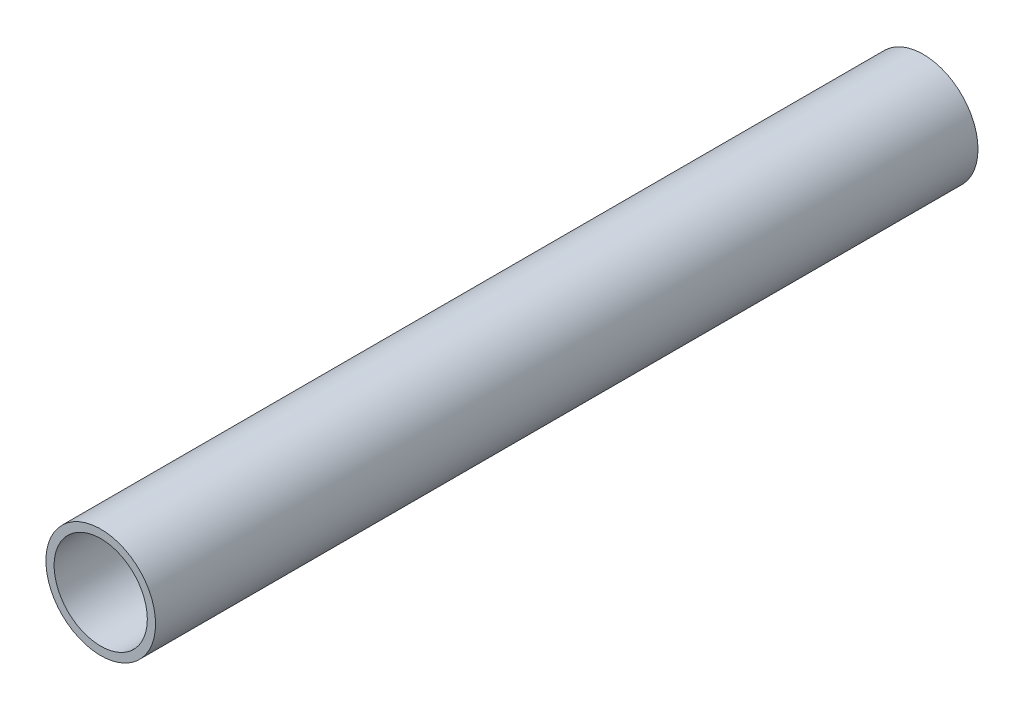
ISO-10303-21;
HEADER;
FILE_DESCRIPTION(('STEP AP214'),'2;1');
FILE_NAME('part.step','',(''),(''),'','','');
FILE_SCHEMA(('AUTOMOTIVE_DESIGN { 1 0 10303 214 1 1 1 1 }'));
ENDSEC;
DATA;
#1=APPLICATION_CONTEXT('core data for automotive mechanical design processes');
#2=APPLICATION_PROTOCOL_DEFINITION('international standard','automotive_design',2000,#1);
#3=PRODUCT_CONTEXT('',#1,'mechanical');
#4=PRODUCT('Part','Part','',(#3));
#5=PRODUCT_RELATED_PRODUCT_CATEGORY('part','',(#4));
#6=PRODUCT_DEFINITION_FORMATION('','',#4);
#7=PRODUCT_DEFINITION_CONTEXT('part definition',#1,'design');
#8=PRODUCT_DEFINITION('design','',#6,#7);
#9=PRODUCT_DEFINITION_SHAPE('','',#8);
#10=(LENGTH_UNIT() NAMED_UNIT(*) SI_UNIT(.MILLI.,.METRE.));
#11=(NAMED_UNIT(*) PLANE_ANGLE_UNIT() SI_UNIT($,.RADIAN.));
#12=(NAMED_UNIT(*) SI_UNIT($,.STERADIAN.) SOLID_ANGLE_UNIT());
#13=UNCERTAINTY_MEASURE_WITH_UNIT(LENGTH_MEASURE(1.E-05),#10,'distance_accuracy_value','');
#14=(GEOMETRIC_REPRESENTATION_CONTEXT(3) GLOBAL_UNCERTAINTY_ASSIGNED_CONTEXT((#13)) GLOBAL_UNIT_ASSIGNED_CONTEXT((#10,
#11,#12)) REPRESENTATION_CONTEXT('',''));
#15=CARTESIAN_POINT('',(0.,0.,0.));
#16=DIRECTION('',(0.,0.,1.));
#17=DIRECTION('',(1.,0.,0.));
#18=AXIS2_PLACEMENT_3D('',#15,#16,#17);
#19=CARTESIAN_POINT('',(0.,0.,300.));
#20=DIRECTION('',(0.,0.,1.));
#21=DIRECTION('',(1.,0.,0.));
#22=AXIS2_PLACEMENT_3D('',#19,#20,#21);
#23=PLANE('',#22);
#24=CARTESIAN_POINT('',(0.,0.,300.));
#25=DIRECTION('',(0.,0.,1.));
#26=DIRECTION('',(1.,0.,0.));
#27=AXIS2_PLACEMENT_3D('',#24,#25,#26);
#28=CIRCLE('',#27,20.);
#29=CARTESIAN_POINT('',(20.,0.,300.));
#30=VERTEX_POINT('',#29);
#31=EDGE_CURVE('E10',#30,#30,#28,.T.);
#32=ORIENTED_EDGE('',*,*,#31,.T.);
#33=EDGE_LOOP('',(#32));
#34=FACE_BOUND('',#33,.T.);
#35=CARTESIAN_POINT('',(0.,0.,300.));
#36=DIRECTION('',(0.,0.,1.));
#37=DIRECTION('',(1.,0.,0.));
#38=AXIS2_PLACEMENT_3D('',#35,#36,#37);
#39=CIRCLE('',#38,17.);
#40=CARTESIAN_POINT('',(17.,0.,300.));
#41=VERTEX_POINT('',#40);
#42=EDGE_CURVE('E42',#41,#41,#39,.T.);
#43=ORIENTED_EDGE('',*,*,#42,.F.);
#44=EDGE_LOOP('',(#43));
#45=FACE_BOUND('',#44,.T.);
#46=ADVANCED_FACE('F31',(#34,#45),#23,.T.);
#47=CARTESIAN_POINT('',(0.,0.,0.));
#48=DIRECTION('',(0.,0.,1.));
#49=DIRECTION('',(1.,0.,0.));
#50=AXIS2_PLACEMENT_3D('',#47,#48,#49);
#51=PLANE('',#50);
#52=CARTESIAN_POINT('',(0.,0.,0.));
#53=DIRECTION('',(0.,0.,1.));
#54=DIRECTION('',(1.,0.,0.));
#55=AXIS2_PLACEMENT_3D('',#52,#53,#54);
#56=CIRCLE('',#55,20.);
#57=CARTESIAN_POINT('',(20.,0.,0.));
#58=VERTEX_POINT('',#57);
#59=EDGE_CURVE('E35',#58,#58,#56,.T.);
#60=ORIENTED_EDGE('',*,*,#59,.F.);
#61=EDGE_LOOP('',(#60));
#62=FACE_BOUND('',#61,.T.);
#63=CARTESIAN_POINT('',(0.,0.,0.));
#64=DIRECTION('',(0.,0.,1.));
#65=DIRECTION('',(1.,0.,0.));
#66=AXIS2_PLACEMENT_3D('',#63,#64,#65);
#67=CIRCLE('',#66,17.);
#68=CARTESIAN_POINT('',(17.,0.,0.));
#69=VERTEX_POINT('',#68);
#70=EDGE_CURVE('E44',#69,#69,#67,.T.);
#71=ORIENTED_EDGE('',*,*,#70,.T.);
#72=EDGE_LOOP('',(#71));
#73=FACE_BOUND('',#72,.T.);
#74=ADVANCED_FACE('F54',(#62,#73),#51,.F.);
#75=CARTESIAN_POINT('',(0.,0.,300.));
#76=DIRECTION('',(0.,0.,-1.));
#77=DIRECTION('',(-1.,0.,0.));
#78=AXIS2_PLACEMENT_3D('',#75,#76,#77);
#79=CYLINDRICAL_SURFACE('',#78,20.);
#80=ORIENTED_EDGE('',*,*,#31,.F.);
#81=EDGE_LOOP('',(#80));
#82=FACE_BOUND('',#81,.T.);
#83=ORIENTED_EDGE('',*,*,#59,.T.);
#84=EDGE_LOOP('',(#83));
#85=FACE_BOUND('',#84,.T.);
#86=ADVANCED_FACE('F33',(#82,#85),#79,.T.);
#87=CARTESIAN_POINT('',(0.,0.,300.));
#88=DIRECTION('',(0.,0.,-1.));
#89=DIRECTION('',(-1.,0.,0.));
#90=AXIS2_PLACEMENT_3D('',#87,#88,#89);
#91=CYLINDRICAL_SURFACE('',#90,17.);
#92=ORIENTED_EDGE('',*,*,#42,.T.);
#93=EDGE_LOOP('',(#92));
#94=FACE_BOUND('',#93,.T.);
#95=ORIENTED_EDGE('',*,*,#70,.F.);
#96=EDGE_LOOP('',(#95));
#97=FACE_BOUND('',#96,.T.);
#98=ADVANCED_FACE('F50',(#94,#97),#91,.F.);
#99=CLOSED_SHELL('',(#46,#74,#86,#98));
#100=MANIFOLD_SOLID_BREP('B2',#99);
#101=ADVANCED_BREP_SHAPE_REPRESENTATION('',(#18,#100),#14);
#102=SHAPE_DEFINITION_REPRESENTATION(#9,#101);
ENDSEC;
END-ISO-10303-21;
